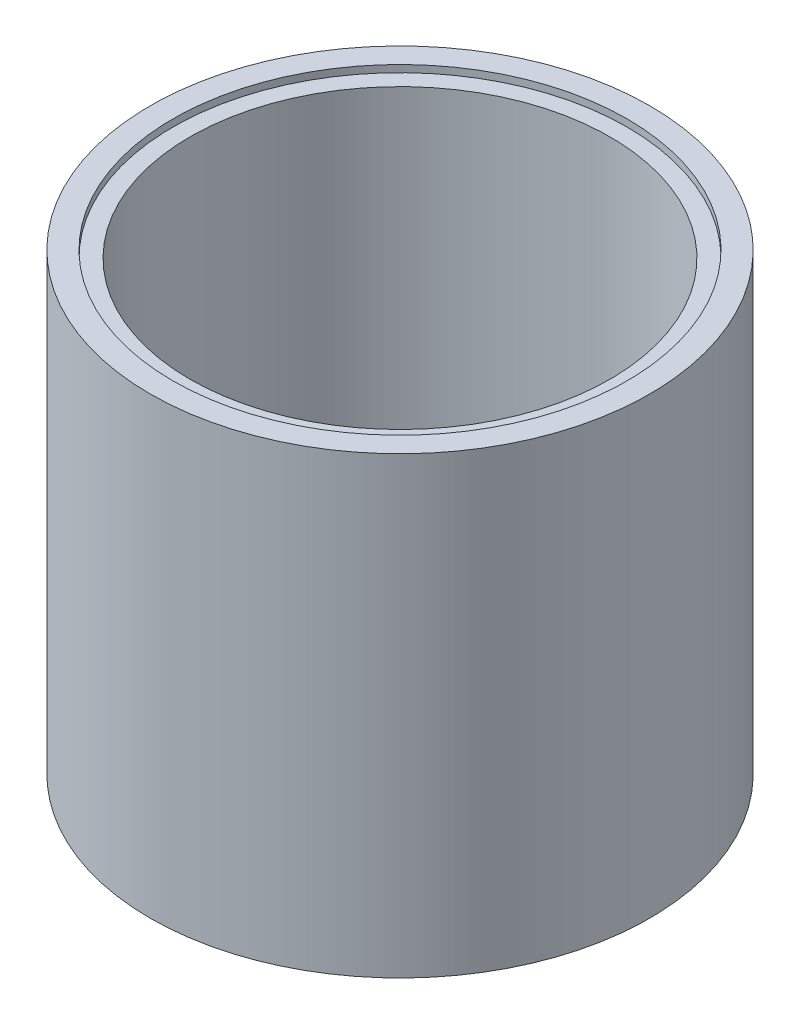
ISO-10303-21;
HEADER;
FILE_DESCRIPTION(('STEP AP214'),'2;1');
FILE_NAME('part.step','',(''),(''),'','','');
FILE_SCHEMA(('AUTOMOTIVE_DESIGN { 1 0 10303 214 1 1 1 1 }'));
ENDSEC;
DATA;
#1=APPLICATION_CONTEXT('core data for automotive mechanical design processes');
#2=APPLICATION_PROTOCOL_DEFINITION('international standard','automotive_design',2000,#1);
#3=PRODUCT_CONTEXT('',#1,'mechanical');
#4=PRODUCT('Part','Part','',(#3));
#5=PRODUCT_RELATED_PRODUCT_CATEGORY('part','',(#4));
#6=PRODUCT_DEFINITION_FORMATION('','',#4);
#7=PRODUCT_DEFINITION_CONTEXT('part definition',#1,'design');
#8=PRODUCT_DEFINITION('design','',#6,#7);
#9=PRODUCT_DEFINITION_SHAPE('','',#8);
#10=(LENGTH_UNIT() NAMED_UNIT(*) SI_UNIT(.MILLI.,.METRE.));
#11=(NAMED_UNIT(*) PLANE_ANGLE_UNIT() SI_UNIT($,.RADIAN.));
#12=(NAMED_UNIT(*) SI_UNIT($,.STERADIAN.) SOLID_ANGLE_UNIT());
#13=UNCERTAINTY_MEASURE_WITH_UNIT(LENGTH_MEASURE(1.E-05),#10,'distance_accuracy_value','');
#14=(GEOMETRIC_REPRESENTATION_CONTEXT(3) GLOBAL_UNCERTAINTY_ASSIGNED_CONTEXT((#13)) GLOBAL_UNIT_ASSIGNED_CONTEXT((#10,
#11,#12)) REPRESENTATION_CONTEXT('',''));
#15=CARTESIAN_POINT('',(0.,0.,0.));
#16=DIRECTION('',(0.,0.,1.));
#17=DIRECTION('',(1.,0.,0.));
#18=AXIS2_PLACEMENT_3D('',#15,#16,#17);
#19=CARTESIAN_POINT('',(0.,-101.6,0.));
#20=DIRECTION('',(0.,1.,0.));
#21=DIRECTION('',(0.,0.,1.));
#22=AXIS2_PLACEMENT_3D('',#19,#20,#21);
#23=CYLINDRICAL_SURFACE('',#22,46.99);
#24=CARTESIAN_POINT('',(-45.4561034694882,-84.3499852276035,11.9080962950079));
#25=CARTESIAN_POINT('',(-45.4561058130241,-84.1981737050387,11.9080899439388));
#26=CARTESIAN_POINT('',(-45.4593636655691,-84.0462553100001,11.8956727916659));
#27=CARTESIAN_POINT('',(-45.472253273039,-83.7466117047896,11.8463035601951));
#28=CARTESIAN_POINT('',(-45.4818924852461,-83.5988916116604,11.8093227756702));
#29=CARTESIAN_POINT('',(-45.5070882668642,-83.3120284653248,11.7118545270657));
#30=CARTESIAN_POINT('',(-45.522641757752,-83.1728809935772,11.6513792920537));
#31=CARTESIAN_POINT('',(-45.5589459358841,-82.9070647986837,11.5086030745555));
#32=CARTESIAN_POINT('',(-45.5796954175578,-82.7803931903815,11.4263071546308));
#33=CARTESIAN_POINT('',(-45.625493277266,-82.5429233046936,11.2420398316861));
#34=CARTESIAN_POINT('',(-45.6505465306987,-82.4321432936946,11.1400460981311));
#35=CARTESIAN_POINT('',(-45.7038615298065,-82.2297573518143,10.9192496280313));
#36=CARTESIAN_POINT('',(-45.7321234080237,-82.1381522134539,10.8004461970612));
#37=CARTESIAN_POINT('',(-45.7907237197008,-81.9766625163465,10.5492342129224));
#38=CARTESIAN_POINT('',(-45.8210635471041,-81.9067927158715,10.4168164964876));
#39=CARTESIAN_POINT('',(-45.8826430568622,-81.7908516185852,10.1421376378696));
#40=CARTESIAN_POINT('',(-45.9138827307714,-81.7447800984912,9.99987658805378));
#41=CARTESIAN_POINT('',(-45.976127320397,-81.67779307136,9.70967573690254));
#42=CARTESIAN_POINT('',(-46.0071324597399,-81.6568494649662,9.56174247001119));
#43=CARTESIAN_POINT('',(-46.0679615692236,-81.640626025455,9.26423584607406));
#44=CARTESIAN_POINT('',(-46.097785550984,-81.6453459398137,9.11466250518073));
#45=CARTESIAN_POINT('',(-46.1553921258739,-81.6802923265845,8.81831294612777));
#46=CARTESIAN_POINT('',(-46.1831770962836,-81.7104885656189,8.67153362327078));
#47=CARTESIAN_POINT('',(-46.23609906616,-81.7954835454148,8.38477880388927));
#48=CARTESIAN_POINT('',(-46.261236051879,-81.8502824139005,8.24480334269115));
#49=CARTESIAN_POINT('',(-46.3084104819266,-81.9829614491602,7.97558323220313));
#50=CARTESIAN_POINT('',(-46.3304460706354,-82.0608553482461,7.84634502598448));
#51=CARTESIAN_POINT('',(-46.3710994576594,-82.2375033179584,7.6024043304262));
#52=CARTESIAN_POINT('',(-46.3897172235405,-82.3362575865242,7.48770197903061));
#53=CARTESIAN_POINT('',(-46.4233954201796,-82.5519938448825,7.27598731221977));
#54=CARTESIAN_POINT('',(-46.4384506508485,-82.6690020711962,7.17900090253813));
#55=CARTESIAN_POINT('',(-46.46490442818,-82.9178327871757,7.00574495640354));
#56=CARTESIAN_POINT('',(-46.4763029736092,-83.0496552818378,6.92947542693794));
#57=CARTESIAN_POINT('',(-46.4954403985783,-83.3243890175638,6.79988487637309));
#58=CARTESIAN_POINT('',(-46.5031791106311,-83.4673007657637,6.74656490553867));
#59=CARTESIAN_POINT('',(-46.5150179075219,-83.7601487798388,6.66445383004559));
#60=CARTESIAN_POINT('',(-46.5191180286506,-83.9100849756377,6.63566248074324));
#61=CARTESIAN_POINT('',(-46.5236965323147,-84.2124953992734,6.60348622897096));
#62=CARTESIAN_POINT('',(-46.5241801033445,-84.3649656764936,6.60006492934371));
#63=CARTESIAN_POINT('',(-46.5215419561189,-84.6683186767185,6.61863419238211));
#64=CARTESIAN_POINT('',(-46.5184202537405,-84.8192014067115,6.64062464314001));
#65=CARTESIAN_POINT('',(-46.5085586272901,-85.1149928014364,6.70934165967456));
#66=CARTESIAN_POINT('',(-46.501821146978,-85.2599054299771,6.75605151829408));
#67=CARTESIAN_POINT('',(-46.4847060014439,-85.5397653302039,6.8728211021828));
#68=CARTESIAN_POINT('',(-46.4743283082256,-85.6747125252386,6.94288100703178));
#69=CARTESIAN_POINT('',(-46.4499120975216,-85.930979619194,7.10439435034346));
#70=CARTESIAN_POINT('',(-46.4358694235995,-86.0522838207092,7.19587206643901));
#71=CARTESIAN_POINT('',(-46.4041724991599,-86.2776635130893,7.39751738899773));
#72=CARTESIAN_POINT('',(-46.3865182184562,-86.3817388599398,7.50768515167375));
#73=CARTESIAN_POINT('',(-46.347707940668,-86.569830241858,7.74366556306341));
#74=CARTESIAN_POINT('',(-46.3265478498989,-86.6538225427628,7.86949645816637));
#75=CARTESIAN_POINT('',(-46.2810019127517,-86.7992012577729,8.1330698037272));
#76=CARTESIAN_POINT('',(-46.2566160838154,-86.8605877941023,8.2708121897774));
#77=CARTESIAN_POINT('',(-46.2050559035016,-86.9589710646247,8.55415774597696));
#78=CARTESIAN_POINT('',(-46.1778832893799,-86.9959828882562,8.69975599234665));
#79=CARTESIAN_POINT('',(-46.1213368266422,-87.0446154991626,8.9947167597653));
#80=CARTESIAN_POINT('',(-46.091962995793,-87.0562364913548,9.14407925042499));
#81=CARTESIAN_POINT('',(-46.0318386411602,-87.0537556105369,9.44208689540195));
#82=CARTESIAN_POINT('',(-46.0010901699182,-87.0396909159685,9.59073277476619));
#83=CARTESIAN_POINT('',(-45.939117346797,-86.9863148965228,9.88331769719191));
#84=CARTESIAN_POINT('',(-45.9078929940539,-86.9470035258075,10.0272567317071));
#85=CARTESIAN_POINT('',(-45.846035604114,-86.8442581563284,10.3063850179232));
#86=CARTESIAN_POINT('',(-45.8154025667322,-86.7808241651122,10.4415742723618));
#87=CARTESIAN_POINT('',(-45.7558707312286,-86.6316398055858,10.6994357934053));
#88=CARTESIAN_POINT('',(-45.7269718846847,-86.5458900607354,10.8221084095681));
#89=CARTESIAN_POINT('',(-45.6720251870832,-86.3543722940792,11.0517054867585));
#90=CARTESIAN_POINT('',(-45.6459811920371,-86.248577711321,11.1586087139973));
#91=CARTESIAN_POINT('',(-45.5978855052382,-86.0200031240991,11.3535477830332));
#92=CARTESIAN_POINT('',(-45.5758347942629,-85.8972189599066,11.4415789907077));
#93=CARTESIAN_POINT('',(-45.536688430908,-85.6380287822624,11.5964007731249));
#94=CARTESIAN_POINT('',(-45.5195983650215,-85.5016076419123,11.6631674086631));
#95=CARTESIAN_POINT('',(-45.4912073788677,-85.2192257795962,11.7734201835088));
#96=CARTESIAN_POINT('',(-45.479899654522,-85.073276498599,11.8169336874931));
#97=CARTESIAN_POINT('',(-45.466557803938,-84.8303545368818,11.8681343866613));
#98=CARTESIAN_POINT('',(-45.4626452152123,-84.7349534910879,11.8831013800143));
#99=CARTESIAN_POINT('',(-45.4574173042586,-84.5430444480994,11.9030843480286));
#100=CARTESIAN_POINT('',(-45.4561019790134,-84.4465364521909,11.9081003342501));
#101=CARTESIAN_POINT('',(-45.4561034694882,-84.3499852276035,11.9080962950079));
#102=B_SPLINE_CURVE_WITH_KNOTS('',3,(#24,#25,#26,#27,#28,#29,#30,#31,#32,#33,#34,#35,#36,#37,
#38,#39,#40,#41,#42,#43,#44,#45,#46,#47,#48,#49,#50,#51,#52,#53,#54,#55,#56,#57,#58,#59,#60,#61,
#62,#63,#64,#65,#66,#67,#68,#69,#70,#71,#72,#73,#74,#75,#76,#77,#78,#79,#80,#81,#82,#83,#84,#85,
#86,#87,#88,#89,#90,#91,#92,#93,#94,#95,#96,#97,#98,#99,#100,#101),.UNSPECIFIED.,.T.,.F.,(4,2,2,
2,2,2,2,2,2,2,2,2,2,2,2,2,2,2,2,2,2,2,2,2,2,2,2,2,2,2,2,2,2,2,2,2,2,2,4),(0.,0.455082105309569,
0.910696962354632,1.36607498492399,1.82134744870246,2.27713909681048,2.73294957962814,
3.18906888514914,3.64518391114441,4.1007884084845,4.55638842277544,5.01144852465084,
5.46651098899613,5.92184457811138,6.37718248798082,6.83318099202265,7.28917964986247,
7.74519917383069,8.2012141494958,8.65657477619227,9.11193339758827,9.56698464713249,
10.0220393964509,10.4776124807363,10.9331893729239,11.3893020342763,11.8454122294961,
12.3012397985104,12.7570636887452,13.2122283249627,13.6673937875825,14.1225591077871,
14.5777117128997,15.0334717024378,15.4893434783478,15.9457266656958,16.4015715842337,
16.6910014302539,16.9804309400376),.UNSPECIFIED.);
#103=CARTESIAN_POINT('',(-45.4561034694882,-84.3499852276035,11.9080962950079));
#104=VERTEX_POINT('',#103);
#105=EDGE_CURVE('E63',#104,#104,#102,.T.);
#106=ORIENTED_EDGE('',*,*,#105,.T.);
#107=EDGE_LOOP('',(#106));
#108=FACE_BOUND('',#107,.T.);
#109=CARTESIAN_POINT('',(0.,-101.6,0.));
#110=DIRECTION('',(0.,1.,0.));
#111=DIRECTION('',(0.,0.,1.));
#112=AXIS2_PLACEMENT_3D('',#109,#110,#111);
#113=CIRCLE('',#112,46.99);
#114=CARTESIAN_POINT('',(0.,-101.6,46.99));
#115=VERTEX_POINT('',#114);
#116=EDGE_CURVE('E47',#115,#115,#113,.T.);
#117=ORIENTED_EDGE('',*,*,#116,.F.);
#118=EDGE_LOOP('',(#117));
#119=FACE_BOUND('',#118,.T.);
#120=CARTESIAN_POINT('',(0.,-1.58750000000001,0.));
#121=DIRECTION('',(0.,1.,0.));
#122=DIRECTION('',(0.,0.,1.));
#123=AXIS2_PLACEMENT_3D('',#120,#121,#122);
#124=CIRCLE('',#123,46.99);
#125=CARTESIAN_POINT('',(0.,-1.58750000000001,46.99));
#126=VERTEX_POINT('',#125);
#127=EDGE_CURVE('E38',#126,#126,#124,.F.);
#128=ORIENTED_EDGE('',*,*,#127,.F.);
#129=EDGE_LOOP('',(#128));
#130=FACE_BOUND('',#129,.T.);
#131=ADVANCED_FACE('F33',(#108,#119,#130),#23,.F.);
#132=CARTESIAN_POINT('',(0.,-101.6,0.));
#133=DIRECTION('',(0.,1.,0.));
#134=DIRECTION('',(0.,0.,1.));
#135=AXIS2_PLACEMENT_3D('',#132,#133,#134);
#136=CYLINDRICAL_SURFACE('',#135,55.88);
#137=CARTESIAN_POINT('',(-54.1835074980889,-84.3499852276035,13.6646227611503));
#138=CARTESIAN_POINT('',(-54.1835096839759,-84.198134116061,13.6646163627581));
#139=CARTESIAN_POINT('',(-54.1866528626883,-84.0461751642908,13.6521693396485));
#140=CARTESIAN_POINT('',(-54.1990966081251,-83.7464488449087,13.602681821403));
#141=CARTESIAN_POINT('',(-54.2084044395543,-83.5986866374424,13.5656123098669));
#142=CARTESIAN_POINT('',(-54.2327598443962,-83.3117390443618,13.467912964419));
#143=CARTESIAN_POINT('',(-54.2478045033208,-83.1725493452812,13.4072950935193));
#144=CARTESIAN_POINT('',(-54.2829717543548,-82.9066570495047,13.2641916464781));
#145=CARTESIAN_POINT('',(-54.3030931437812,-82.7799515051706,13.181711249359));
#146=CARTESIAN_POINT('',(-54.3475790545708,-82.5424650048451,12.9970784630685));
#147=CARTESIAN_POINT('',(-54.3719471130127,-82.4316974652495,12.8949096677367));
#148=CARTESIAN_POINT('',(-54.4239176765213,-82.2293455621169,12.6737704843047));
#149=CARTESIAN_POINT('',(-54.4515203132244,-82.137761979725,12.5547994123684));
#150=CARTESIAN_POINT('',(-54.5088954563717,-81.9763416904009,12.3033058110089));
#151=CARTESIAN_POINT('',(-54.5386689832716,-81.9065152931117,12.1707768965904));
#152=CARTESIAN_POINT('',(-54.5992783341585,-81.790657698103,11.8959232374673));
#153=CARTESIAN_POINT('',(-54.6301141504748,-81.7446263286016,11.7535985634892));
#154=CARTESIAN_POINT('',(-54.6917696629453,-81.6777005052734,11.4632771849331));
#155=CARTESIAN_POINT('',(-54.7225893525412,-81.6567861846634,11.3152850588716));
#156=CARTESIAN_POINT('',(-54.7832770471479,-81.6406268355542,11.0177134870832));
#157=CARTESIAN_POINT('',(-54.8131450592853,-81.6453816147879,10.868134053254));
#158=CARTESIAN_POINT('',(-54.8710749723699,-81.6804089915073,10.571769772366));
#159=CARTESIAN_POINT('',(-54.899138365836,-81.7106602021246,10.4249826885247));
#160=CARTESIAN_POINT('',(-54.9528102941612,-81.795788572894,10.1382606258025));
#161=CARTESIAN_POINT('',(-54.9784188192022,-81.8506658315307,9.99832567432711));
#162=CARTESIAN_POINT('',(-55.0266728998556,-81.9835129359303,9.72925390106925));
#163=CARTESIAN_POINT('',(-55.0493171986263,-82.0614925317251,9.60012166799623));
#164=CARTESIAN_POINT('',(-55.091260650746,-82.2383236280287,9.35642630409393));
#165=CARTESIAN_POINT('',(-55.1105597820327,-82.3371752661846,9.2418632693537));
#166=CARTESIAN_POINT('',(-55.1455895779015,-82.5530653307961,9.03049641375834));
#167=CARTESIAN_POINT('',(-55.1613165611089,-82.6701223119005,8.93371093351671));
#168=CARTESIAN_POINT('',(-55.1890351375662,-82.9190350384579,8.7608498127066));
#169=CARTESIAN_POINT('',(-55.201026729869,-83.0508907876625,8.68477417738826));
#170=CARTESIAN_POINT('',(-55.2212033080971,-83.3256693680614,8.55554813525449));
#171=CARTESIAN_POINT('',(-55.2293881802836,-83.4685925297838,8.50239841343272));
#172=CARTESIAN_POINT('',(-55.2419211625152,-83.7614438065604,8.42058631507637));
#173=CARTESIAN_POINT('',(-55.2462692996107,-83.9113718722193,8.39192376589731));
#174=CARTESIAN_POINT('',(-55.2511173991229,-84.2138141165647,8.35994576377231));
#175=CARTESIAN_POINT('',(-55.25162126248,-84.3663255162463,8.35660461619628));
#176=CARTESIAN_POINT('',(-55.2487903613457,-84.669748400107,8.37529996762097));
#177=CARTESIAN_POINT('',(-55.2454556087401,-84.8206598892387,8.39733638804416));
#178=CARTESIAN_POINT('',(-55.2349560894755,-85.1165262588849,8.46612206522821));
#179=CARTESIAN_POINT('',(-55.2277931431039,-85.261483935161,8.51285957662459));
#180=CARTESIAN_POINT('',(-55.2096606586063,-85.5414139614535,8.62967226160344));
#181=CARTESIAN_POINT('',(-55.1986910998505,-85.6763862573497,8.69974756166391));
#182=CARTESIAN_POINT('',(-55.1729925965574,-85.9326335995537,8.8612614635462));
#183=CARTESIAN_POINT('',(-55.1582606273454,-86.0538975117403,8.95271724852404));
#184=CARTESIAN_POINT('',(-55.1251612248868,-86.2791738662033,9.15431079532723));
#185=CARTESIAN_POINT('',(-55.1067937697683,-86.383186204684,9.26444866954704));
#186=CARTESIAN_POINT('',(-55.0666184325548,-86.5710940614614,9.50032800542304));
#187=CARTESIAN_POINT('',(-55.0448077081808,-86.6549728148445,9.62608233936966));
#188=CARTESIAN_POINT('',(-54.9980910951253,-86.8001178875697,9.88950176599057));
#189=CARTESIAN_POINT('',(-54.9731852192846,-86.8613843007186,10.0271668092506));
#190=CARTESIAN_POINT('',(-54.9207694501429,-86.9595362358926,10.3103927083747));
#191=CARTESIAN_POINT('',(-54.8932607098481,-86.9964324960373,10.4559500560509));
#192=CARTESIAN_POINT('',(-54.8362668501409,-87.0448319448112,10.7508503028592));
#193=CARTESIAN_POINT('',(-54.8067817409578,-87.0563352648587,10.9001931823955));
#194=CARTESIAN_POINT('',(-54.7466586021829,-87.0536210275248,11.1982526680273));
#195=CARTESIAN_POINT('',(-54.7160217831251,-87.0394297756344,11.3469697585722));
#196=CARTESIAN_POINT('',(-54.654493700487,-86.9857835890219,11.6397208003139));
#197=CARTESIAN_POINT('',(-54.6236024364246,-86.9463286064193,11.7837547426345));
#198=CARTESIAN_POINT('',(-54.5625950258779,-86.8432802360548,12.0630874743849));
#199=CARTESIAN_POINT('',(-54.5324788860584,-86.7796866408154,12.1983861887214));
#200=CARTESIAN_POINT('',(-54.4741082900461,-86.63017097589,12.4564622640491));
#201=CARTESIAN_POINT('',(-54.4458537757482,-86.5442496035152,12.5792400159115));
#202=CARTESIAN_POINT('',(-54.3922653502774,-86.3524238417688,12.8089742806855));
#203=CARTESIAN_POINT('',(-54.366934133552,-86.2465012502771,12.9159162227921));
#204=CARTESIAN_POINT('',(-54.320241682396,-86.0176892153969,13.1109048118691));
#205=CARTESIAN_POINT('',(-54.2988814268663,-85.894795601378,13.1989468005465));
#206=CARTESIAN_POINT('',(-54.2610224358517,-85.6354381338088,13.3537342950153));
#207=CARTESIAN_POINT('',(-54.2445282348474,-85.4989617804025,13.4204599417323));
#208=CARTESIAN_POINT('',(-54.2171626992813,-85.2165050128185,13.5305919825754));
#209=CARTESIAN_POINT('',(-54.2062847174169,-85.0705360655635,13.5740259468778));
#210=CARTESIAN_POINT('',(-54.1934949045704,-84.8280464490846,13.6249731711232));
#211=CARTESIAN_POINT('',(-54.1897566655379,-84.7330967745243,13.6398232669685));
#212=CARTESIAN_POINT('',(-54.1847622717372,-84.5421075337042,13.6596500823033));
#213=CARTESIAN_POINT('',(-54.183506114984,-84.4460679683162,13.6646268096888));
#214=CARTESIAN_POINT('',(-54.1835074980889,-84.3499852276035,13.6646227611503));
#215=B_SPLINE_CURVE_WITH_KNOTS('',3,(#137,#138,#139,#140,#141,#142,#143,#144,#145,#146,#147,
#148,#149,#150,#151,#152,#153,#154,#155,#156,#157,#158,#159,#160,#161,#162,#163,#164,#165,#166,
#167,#168,#169,#170,#171,#172,#173,#174,#175,#176,#177,#178,#179,#180,#181,#182,#183,#184,#185,
#186,#187,#188,#189,#190,#191,#192,#193,#194,#195,#196,#197,#198,#199,#200,#201,#202,#203,#204,
#205,#206,#207,#208,#209,#210,#211,#212,#213,#214),.UNSPECIFIED.,.T.,.F.,(4,2,2,2,2,2,2,2,2,2,2,
2,2,2,2,2,2,2,2,2,2,2,2,2,2,2,2,2,2,2,2,2,2,2,2,2,2,2,4),(0.,0.455202598036769,
0.910942584094645,1.3664513477517,1.82185230204419,2.27763439164285,2.73343503647221,
3.18945133515058,3.64546434169184,4.10111641845327,4.55676508228626,5.01203191971919,
5.46730057787508,5.92276165044667,6.37822572679034,6.83415708554147,7.29008855987517,
7.7460336558491,8.20197553719901,8.65745469421835,9.1129324409242,9.56819380264041,
10.0234576316634,10.479088614534,10.9347223386515,11.3907341556403,11.8467440808522,
12.3025529420199,12.7583594441946,13.2136995663559,13.669040551493,14.124385450493,
14.5797161304812,15.0354631990724,15.4913224675175,15.9476052007172,16.4033466368392,
16.6913731631701,16.9793994591557),.UNSPECIFIED.);
#216=CARTESIAN_POINT('',(-54.1835074980889,-84.3499852276035,13.6646227611503));
#217=VERTEX_POINT('',#216);
#218=EDGE_CURVE('E55',#217,#217,#215,.T.);
#219=ORIENTED_EDGE('',*,*,#218,.F.);
#220=EDGE_LOOP('',(#219));
#221=FACE_BOUND('',#220,.T.);
#222=CARTESIAN_POINT('',(0.,-101.6,0.));
#223=DIRECTION('',(0.,1.,0.));
#224=DIRECTION('',(0.,0.,1.));
#225=AXIS2_PLACEMENT_3D('',#222,#223,#224);
#226=CIRCLE('',#225,55.88);
#227=CARTESIAN_POINT('',(0.,-101.6,55.88));
#228=VERTEX_POINT('',#227);
#229=EDGE_CURVE('E10',#228,#228,#226,.T.);
#230=ORIENTED_EDGE('',*,*,#229,.T.);
#231=EDGE_LOOP('',(#230));
#232=FACE_BOUND('',#231,.T.);
#233=CARTESIAN_POINT('',(0.,0.,0.));
#234=DIRECTION('',(0.,1.,0.));
#235=DIRECTION('',(0.,0.,1.));
#236=AXIS2_PLACEMENT_3D('',#233,#234,#235);
#237=CIRCLE('',#236,55.88);
#238=CARTESIAN_POINT('',(0.,0.,55.88));
#239=VERTEX_POINT('',#238);
#240=EDGE_CURVE('E42',#239,#239,#237,.T.);
#241=ORIENTED_EDGE('',*,*,#240,.F.);
#242=EDGE_LOOP('',(#241));
#243=FACE_BOUND('',#242,.T.);
#244=ADVANCED_FACE('F35',(#221,#232,#243),#136,.T.);
#245=CARTESIAN_POINT('',(0.,-101.6,0.));
#246=DIRECTION('',(0.,1.,0.));
#247=DIRECTION('',(0.,0.,1.));
#248=AXIS2_PLACEMENT_3D('',#245,#246,#247);
#249=PLANE('',#248);
#250=ORIENTED_EDGE('',*,*,#116,.T.);
#251=EDGE_LOOP('',(#250));
#252=FACE_BOUND('',#251,.T.);
#253=ORIENTED_EDGE('',*,*,#229,.F.);
#254=EDGE_LOOP('',(#253));
#255=FACE_BOUND('',#254,.T.);
#256=ADVANCED_FACE('F86',(#252,#255),#249,.F.);
#257=CARTESIAN_POINT('',(0.,0.,0.));
#258=DIRECTION('',(0.,1.,0.));
#259=DIRECTION('',(0.,0.,1.));
#260=AXIS2_PLACEMENT_3D('',#257,#258,#259);
#261=PLANE('',#260);
#262=CARTESIAN_POINT('',(0.,0.,0.));
#263=DIRECTION('',(0.,1.,0.));
#264=DIRECTION('',(0.,0.,1.));
#265=AXIS2_PLACEMENT_3D('',#262,#263,#264);
#266=CIRCLE('',#265,50.8);
#267=CARTESIAN_POINT('',(0.,0.,50.8));
#268=VERTEX_POINT('',#267);
#269=EDGE_CURVE('E51',#268,#268,#266,.T.);
#270=ORIENTED_EDGE('',*,*,#269,.F.);
#271=EDGE_LOOP('',(#270));
#272=FACE_BOUND('',#271,.T.);
#273=ORIENTED_EDGE('',*,*,#240,.T.);
#274=EDGE_LOOP('',(#273));
#275=FACE_BOUND('',#274,.T.);
#276=ADVANCED_FACE('F78',(#272,#275),#261,.T.);
#277=CARTESIAN_POINT('',(0.,-1.5875,0.));
#278=DIRECTION('',(0.,1.,0.));
#279=DIRECTION('',(0.,0.,1.));
#280=AXIS2_PLACEMENT_3D('',#277,#278,#279);
#281=PLANE('',#280);
#282=CARTESIAN_POINT('',(0.,-1.5875,0.));
#283=DIRECTION('',(0.,1.,0.));
#284=DIRECTION('',(0.,0.,1.));
#285=AXIS2_PLACEMENT_3D('',#282,#283,#284);
#286=CIRCLE('',#285,50.8);
#287=CARTESIAN_POINT('',(0.,-1.5875,50.8));
#288=VERTEX_POINT('',#287);
#289=EDGE_CURVE('E54',#288,#288,#286,.T.);
#290=ORIENTED_EDGE('',*,*,#289,.T.);
#291=EDGE_LOOP('',(#290));
#292=FACE_BOUND('',#291,.T.);
#293=ORIENTED_EDGE('',*,*,#127,.T.);
#294=EDGE_LOOP('',(#293));
#295=FACE_BOUND('',#294,.T.);
#296=ADVANCED_FACE('F75',(#292,#295),#281,.T.);
#297=CARTESIAN_POINT('',(0.,-1.5875,0.));
#298=DIRECTION('',(0.,1.,0.));
#299=DIRECTION('',(0.,0.,1.));
#300=AXIS2_PLACEMENT_3D('',#297,#298,#299);
#301=CYLINDRICAL_SURFACE('',#300,50.8);
#302=ORIENTED_EDGE('',*,*,#289,.F.);
#303=EDGE_LOOP('',(#302));
#304=FACE_BOUND('',#303,.T.);
#305=ORIENTED_EDGE('',*,*,#269,.T.);
#306=EDGE_LOOP('',(#305));
#307=FACE_BOUND('',#306,.T.);
#308=ADVANCED_FACE('F70',(#304,#307),#301,.F.);
#309=CARTESIAN_POINT('',(-54.7814743232577,-84.3499852276035,11.0256279172778));
#310=DIRECTION('',(-0.980341344367533,0.,0.197309017846775));
#311=DIRECTION('',(0.197309017846775,0.,0.980341344367533));
#312=AXIS2_PLACEMENT_3D('',#309,#310,#311);
#313=CYLINDRICAL_SURFACE('',#312,2.70509999999999);
#314=ORIENTED_EDGE('',*,*,#218,.T.);
#315=EDGE_LOOP('',(#314));
#316=FACE_BOUND('',#315,.T.);
#317=ORIENTED_EDGE('',*,*,#105,.F.);
#318=EDGE_LOOP('',(#317));
#319=FACE_BOUND('',#318,.T.);
#320=ADVANCED_FACE('F67',(#316,#319),#313,.F.);
#321=CLOSED_SHELL('',(#131,#244,#256,#276,#296,#308,#320));
#322=MANIFOLD_SOLID_BREP('B2',#321);
#323=ADVANCED_BREP_SHAPE_REPRESENTATION('',(#18,#322),#14);
#324=SHAPE_DEFINITION_REPRESENTATION(#9,#323);
ENDSEC;
END-ISO-10303-21;
